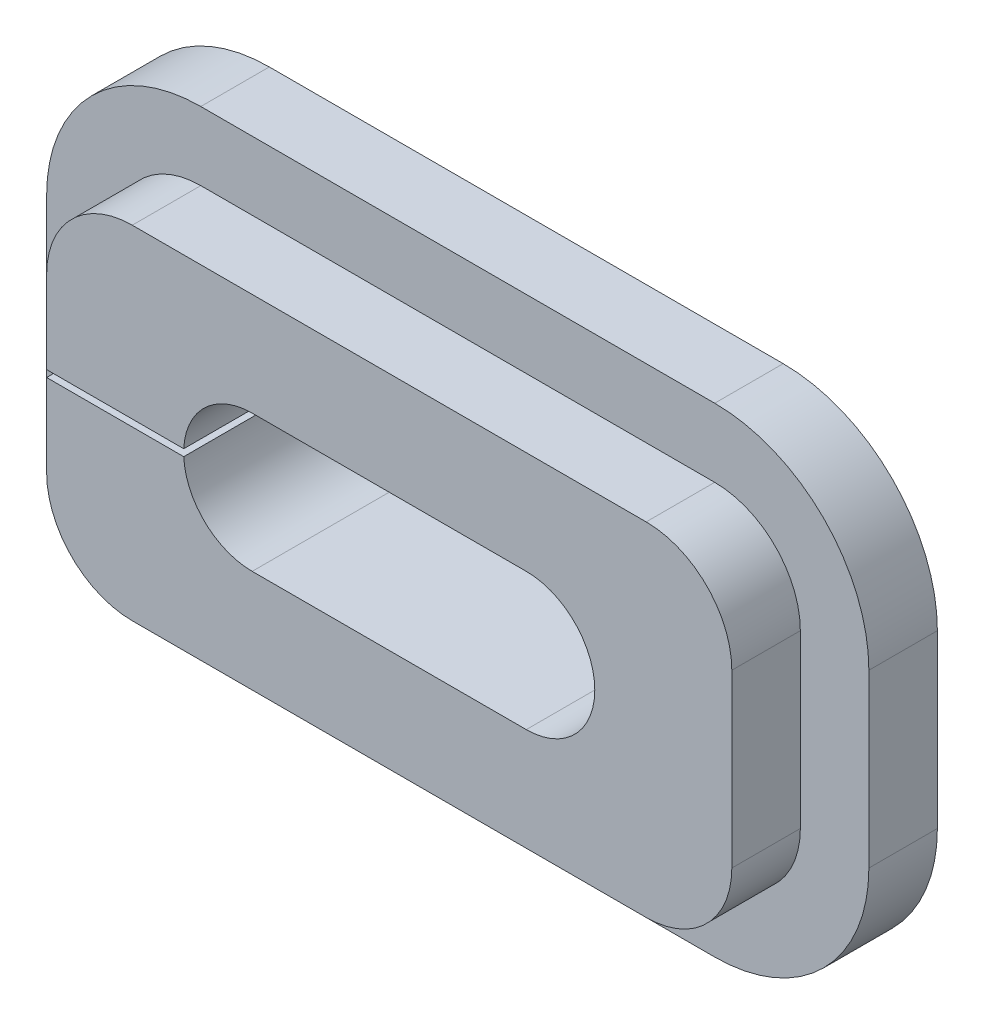
ISO-10303-21;
HEADER;
FILE_DESCRIPTION(('STEP AP214'),'2;1');
FILE_NAME('part.step','',(''),(''),'','','');
FILE_SCHEMA(('AUTOMOTIVE_DESIGN { 1 0 10303 214 1 1 1 1 }'));
ENDSEC;
DATA;
#1=APPLICATION_CONTEXT('core data for automotive mechanical design processes');
#2=APPLICATION_PROTOCOL_DEFINITION('international standard','automotive_design',2000,#1);
#3=PRODUCT_CONTEXT('',#1,'mechanical');
#4=PRODUCT('Part','Part','',(#3));
#5=PRODUCT_RELATED_PRODUCT_CATEGORY('part','',(#4));
#6=PRODUCT_DEFINITION_FORMATION('','',#4);
#7=PRODUCT_DEFINITION_CONTEXT('part definition',#1,'design');
#8=PRODUCT_DEFINITION('design','',#6,#7);
#9=PRODUCT_DEFINITION_SHAPE('','',#8);
#10=(LENGTH_UNIT() NAMED_UNIT(*) SI_UNIT(.MILLI.,.METRE.));
#11=(NAMED_UNIT(*) PLANE_ANGLE_UNIT() SI_UNIT($,.RADIAN.));
#12=(NAMED_UNIT(*) SI_UNIT($,.STERADIAN.) SOLID_ANGLE_UNIT());
#13=UNCERTAINTY_MEASURE_WITH_UNIT(LENGTH_MEASURE(1.E-05),#10,'distance_accuracy_value','');
#14=(GEOMETRIC_REPRESENTATION_CONTEXT(3) GLOBAL_UNCERTAINTY_ASSIGNED_CONTEXT((#13)) GLOBAL_UNIT_ASSIGNED_CONTEXT((#10,
#11,#12)) REPRESENTATION_CONTEXT('',''));
#15=CARTESIAN_POINT('',(0.,0.,0.));
#16=DIRECTION('',(0.,0.,1.));
#17=DIRECTION('',(1.,0.,0.));
#18=AXIS2_PLACEMENT_3D('',#15,#16,#17);
#19=CARTESIAN_POINT('',(-10.,0.,2.));
#20=DIRECTION('',(1.,0.,0.));
#21=DIRECTION('',(0.,1.,0.));
#22=AXIS2_PLACEMENT_3D('',#19,#20,#21);
#23=PLANE('',#22);
#24=DIRECTION('',(0.,-1.,0.));
#25=VECTOR('',#24,1.);
#26=CARTESIAN_POINT('',(-10.,0.,0.));
#27=LINE('',#26,#25);
#28=CARTESIAN_POINT('',(-10.,2.5,0.));
#29=VERTEX_POINT('',#28);
#30=CARTESIAN_POINT('',(-10.,0.0999999999999995,0.));
#31=VERTEX_POINT('',#30);
#32=EDGE_CURVE('E334',#29,#31,#27,.T.);
#33=ORIENTED_EDGE('',*,*,#32,.T.);
#34=DIRECTION('',(0.,0.,1.));
#35=VECTOR('',#34,1.);
#36=CARTESIAN_POINT('',(-10.,0.099999999999999,2.));
#37=LINE('',#36,#35);
#38=CARTESIAN_POINT('',(-10.,0.099999999999999,2.));
#39=VERTEX_POINT('',#38);
#40=EDGE_CURVE('E56',#31,#39,#37,.T.);
#41=ORIENTED_EDGE('',*,*,#40,.T.);
#42=DIRECTION('',(0.,-1.,0.));
#43=VECTOR('',#42,1.);
#44=CARTESIAN_POINT('',(-10.,0.,2.));
#45=LINE('',#44,#43);
#46=CARTESIAN_POINT('',(-10.,2.5,2.));
#47=VERTEX_POINT('',#46);
#48=EDGE_CURVE('E321',#47,#39,#45,.T.);
#49=ORIENTED_EDGE('',*,*,#48,.F.);
#50=DIRECTION('',(0.,0.,-1.));
#51=VECTOR('',#50,1.);
#52=CARTESIAN_POINT('',(-10.,2.5,0.));
#53=LINE('',#52,#51);
#54=EDGE_CURVE('E382',#47,#29,#53,.T.);
#55=ORIENTED_EDGE('',*,*,#54,.T.);
#56=EDGE_LOOP('',(#33,#41,#49,#55));
#57=FACE_BOUND('',#56,.T.);
#58=ADVANCED_FACE('F33',(#57),#23,.F.);
#59=CARTESIAN_POINT('',(-4.,0.,2.));
#60=DIRECTION('',(0.,0.,-1.));
#61=DIRECTION('',(-1.,0.,0.));
#62=AXIS2_PLACEMENT_3D('',#59,#60,#61);
#63=CYLINDRICAL_SURFACE('',#62,2.);
#64=DIRECTION('',(0.,0.,-1.));
#65=VECTOR('',#64,1.);
#66=CARTESIAN_POINT('',(-5.99749843554382,0.1,2.));
#67=LINE('',#66,#65);
#68=CARTESIAN_POINT('',(-5.99749843554382,0.1,-2.));
#69=VERTEX_POINT('',#68);
#70=CARTESIAN_POINT('',(-5.99749843554382,0.1,2.));
#71=VERTEX_POINT('',#70);
#72=EDGE_CURVE('E263',#69,#71,#67,.F.);
#73=ORIENTED_EDGE('',*,*,#72,.F.);
#74=CARTESIAN_POINT('',(-4.,0.,-2.));
#75=DIRECTION('',(0.,0.,-1.));
#76=DIRECTION('',(-1.,0.,0.));
#77=AXIS2_PLACEMENT_3D('',#74,#75,#76);
#78=CIRCLE('',#77,2.);
#79=CARTESIAN_POINT('',(-4.,2.,-2.));
#80=VERTEX_POINT('',#79);
#81=EDGE_CURVE('E246',#80,#69,#78,.F.);
#82=ORIENTED_EDGE('',*,*,#81,.F.);
#83=DIRECTION('',(0.,0.,-1.));
#84=VECTOR('',#83,1.);
#85=CARTESIAN_POINT('',(-4.,2.,2.));
#86=LINE('',#85,#84);
#87=CARTESIAN_POINT('',(-4.,2.,2.));
#88=VERTEX_POINT('',#87);
#89=EDGE_CURVE('E345',#88,#80,#86,.T.);
#90=ORIENTED_EDGE('',*,*,#89,.F.);
#91=CARTESIAN_POINT('',(-4.,0.,2.));
#92=DIRECTION('',(0.,0.,1.));
#93=DIRECTION('',(1.,0.,0.));
#94=AXIS2_PLACEMENT_3D('',#91,#92,#93);
#95=CIRCLE('',#94,2.);
#96=EDGE_CURVE('E301',#88,#71,#95,.T.);
#97=ORIENTED_EDGE('',*,*,#96,.T.);
#98=EDGE_LOOP('',(#73,#82,#90,#97));
#99=FACE_BOUND('',#98,.T.);
#100=ADVANCED_FACE('F466',(#99),#63,.F.);
#101=CARTESIAN_POINT('',(-12.,0.,-2.));
#102=DIRECTION('',(-1.,0.,0.));
#103=DIRECTION('',(0.,0.,1.));
#104=AXIS2_PLACEMENT_3D('',#101,#102,#103);
#105=PLANE('',#104);
#106=DIRECTION('',(0.,0.,1.));
#107=VECTOR('',#106,1.);
#108=CARTESIAN_POINT('',(-12.,0.0999999999999985,-2.));
#109=LINE('',#108,#107);
#110=CARTESIAN_POINT('',(-12.,0.0999999999999985,-2.));
#111=VERTEX_POINT('',#110);
#112=CARTESIAN_POINT('',(-12.,0.0999999999999985,0.));
#113=VERTEX_POINT('',#112);
#114=EDGE_CURVE('E220',#111,#113,#109,.T.);
#115=ORIENTED_EDGE('',*,*,#114,.T.);
#116=DIRECTION('',(0.,-1.,0.));
#117=VECTOR('',#116,1.);
#118=CARTESIAN_POINT('',(-12.,0.,0.));
#119=LINE('',#118,#117);
#120=CARTESIAN_POINT('',(-12.,2.5,0.));
#121=VERTEX_POINT('',#120);
#122=EDGE_CURVE('E266',#121,#113,#119,.T.);
#123=ORIENTED_EDGE('',*,*,#122,.F.);
#124=DIRECTION('',(0.,0.,1.));
#125=VECTOR('',#124,1.);
#126=CARTESIAN_POINT('',(-12.,2.5,-2.));
#127=LINE('',#126,#125);
#128=CARTESIAN_POINT('',(-12.,2.5,-2.));
#129=VERTEX_POINT('',#128);
#130=EDGE_CURVE('E293',#129,#121,#127,.T.);
#131=ORIENTED_EDGE('',*,*,#130,.F.);
#132=DIRECTION('',(0.,-1.,0.));
#133=VECTOR('',#132,1.);
#134=CARTESIAN_POINT('',(-12.,0.,-2.));
#135=LINE('',#134,#133);
#136=EDGE_CURVE('E227',#129,#111,#135,.T.);
#137=ORIENTED_EDGE('',*,*,#136,.T.);
#138=EDGE_LOOP('',(#115,#123,#131,#137));
#139=FACE_BOUND('',#138,.T.);
#140=ADVANCED_FACE('F436',(#139),#105,.T.);
#141=CARTESIAN_POINT('',(10.,0.,2.));
#142=DIRECTION('',(1.,0.,0.));
#143=DIRECTION('',(0.,0.,-1.));
#144=AXIS2_PLACEMENT_3D('',#141,#142,#143);
#145=PLANE('',#144);
#146=DIRECTION('',(0.,-1.,0.));
#147=VECTOR('',#146,1.);
#148=CARTESIAN_POINT('',(10.,0.,0.));
#149=LINE('',#148,#147);
#150=CARTESIAN_POINT('',(10.,2.5,0.));
#151=VERTEX_POINT('',#150);
#152=CARTESIAN_POINT('',(10.,-2.5,0.));
#153=VERTEX_POINT('',#152);
#154=EDGE_CURVE('E300',#151,#153,#149,.T.);
#155=ORIENTED_EDGE('',*,*,#154,.F.);
#156=DIRECTION('',(0.,0.,-1.));
#157=VECTOR('',#156,1.);
#158=CARTESIAN_POINT('',(10.,2.5,2.));
#159=LINE('',#158,#157);
#160=CARTESIAN_POINT('',(10.,2.5,2.));
#161=VERTEX_POINT('',#160);
#162=EDGE_CURVE('E367',#151,#161,#159,.F.);
#163=ORIENTED_EDGE('',*,*,#162,.T.);
#164=DIRECTION('',(0.,-1.,0.));
#165=VECTOR('',#164,1.);
#166=CARTESIAN_POINT('',(10.,0.,2.));
#167=LINE('',#166,#165);
#168=CARTESIAN_POINT('',(10.,-2.5,2.));
#169=VERTEX_POINT('',#168);
#170=EDGE_CURVE('E314',#161,#169,#167,.T.);
#171=ORIENTED_EDGE('',*,*,#170,.T.);
#172=DIRECTION('',(0.,0.,-1.));
#173=VECTOR('',#172,1.);
#174=CARTESIAN_POINT('',(10.,-2.5,0.));
#175=LINE('',#174,#173);
#176=EDGE_CURVE('E364',#169,#153,#175,.T.);
#177=ORIENTED_EDGE('',*,*,#176,.T.);
#178=EDGE_LOOP('',(#155,#163,#171,#177));
#179=FACE_BOUND('',#178,.T.);
#180=ADVANCED_FACE('F484',(#179),#145,.T.);
#181=CARTESIAN_POINT('',(0.,5.,2.));
#182=DIRECTION('',(0.,1.,0.));
#183=DIRECTION('',(0.,0.,1.));
#184=AXIS2_PLACEMENT_3D('',#181,#182,#183);
#185=PLANE('',#184);
#186=DIRECTION('',(1.,0.,0.));
#187=VECTOR('',#186,1.);
#188=CARTESIAN_POINT('',(0.,5.,2.));
#189=LINE('',#188,#187);
#190=CARTESIAN_POINT('',(-7.5,5.,2.));
#191=VERTEX_POINT('',#190);
#192=CARTESIAN_POINT('',(7.5,5.,2.));
#193=VERTEX_POINT('',#192);
#194=EDGE_CURVE('E317',#191,#193,#189,.T.);
#195=ORIENTED_EDGE('',*,*,#194,.T.);
#196=DIRECTION('',(0.,0.,-1.));
#197=VECTOR('',#196,1.);
#198=CARTESIAN_POINT('',(7.5,5.,2.));
#199=LINE('',#198,#197);
#200=CARTESIAN_POINT('',(7.5,5.,0.));
#201=VERTEX_POINT('',#200);
#202=EDGE_CURVE('E349',#193,#201,#199,.T.);
#203=ORIENTED_EDGE('',*,*,#202,.T.);
#204=DIRECTION('',(1.,0.,0.));
#205=VECTOR('',#204,1.);
#206=CARTESIAN_POINT('',(0.,5.,0.));
#207=LINE('',#206,#205);
#208=CARTESIAN_POINT('',(-7.5,5.,0.));
#209=VERTEX_POINT('',#208);
#210=EDGE_CURVE('E330',#209,#201,#207,.T.);
#211=ORIENTED_EDGE('',*,*,#210,.F.);
#212=DIRECTION('',(0.,0.,-1.));
#213=VECTOR('',#212,1.);
#214=CARTESIAN_POINT('',(-7.5,5.,2.));
#215=LINE('',#214,#213);
#216=EDGE_CURVE('E347',#209,#191,#215,.F.);
#217=ORIENTED_EDGE('',*,*,#216,.T.);
#218=EDGE_LOOP('',(#195,#203,#211,#217));
#219=FACE_BOUND('',#218,.T.);
#220=ADVANCED_FACE('F476',(#219),#185,.T.);
#221=CARTESIAN_POINT('',(-10.,-0.100000000000001,2.));
#222=VERTEX_POINT('',#221);
#223=CARTESIAN_POINT('',(-10.,-2.5,2.));
#224=VERTEX_POINT('',#223);
#225=EDGE_CURVE('E320',#222,#224,#45,.T.);
#226=ORIENTED_EDGE('',*,*,#225,.F.);
#227=DIRECTION('',(0.,0.,-1.));
#228=VECTOR('',#227,1.);
#229=CARTESIAN_POINT('',(-10.,-0.100000000000001,2.));
#230=LINE('',#229,#228);
#231=CARTESIAN_POINT('',(-10.,-0.100000000000001,0.));
#232=VERTEX_POINT('',#231);
#233=EDGE_CURVE('E391',#222,#232,#230,.T.);
#234=ORIENTED_EDGE('',*,*,#233,.T.);
#235=CARTESIAN_POINT('',(-10.,-2.5,0.));
#236=VERTEX_POINT('',#235);
#237=EDGE_CURVE('E333',#232,#236,#27,.T.);
#238=ORIENTED_EDGE('',*,*,#237,.T.);
#239=DIRECTION('',(0.,0.,-1.));
#240=VECTOR('',#239,1.);
#241=CARTESIAN_POINT('',(-10.,-2.5,2.));
#242=LINE('',#241,#240);
#243=EDGE_CURVE('E385',#236,#224,#242,.F.);
#244=ORIENTED_EDGE('',*,*,#243,.T.);
#245=EDGE_LOOP('',(#226,#234,#238,#244));
#246=FACE_BOUND('',#245,.T.);
#247=ADVANCED_FACE('F395',(#246),#23,.F.);
#248=DIRECTION('',(0.,0.,-1.));
#249=VECTOR('',#248,1.);
#250=CARTESIAN_POINT('',(-5.99749843554382,-0.100000000000001,2.));
#251=LINE('',#250,#249);
#252=CARTESIAN_POINT('',(-5.99749843554382,-0.100000000000001,2.));
#253=VERTEX_POINT('',#252);
#254=CARTESIAN_POINT('',(-5.99749843554382,-0.100000000000001,-2.));
#255=VERTEX_POINT('',#254);
#256=EDGE_CURVE('E206',#253,#255,#251,.T.);
#257=ORIENTED_EDGE('',*,*,#256,.F.);
#258=CARTESIAN_POINT('',(-4.,-2.,2.));
#259=VERTEX_POINT('',#258);
#260=EDGE_CURVE('E305',#253,#259,#95,.T.);
#261=ORIENTED_EDGE('',*,*,#260,.T.);
#262=DIRECTION('',(0.,0.,-1.));
#263=VECTOR('',#262,1.);
#264=CARTESIAN_POINT('',(-4.,-2.,2.));
#265=LINE('',#264,#263);
#266=CARTESIAN_POINT('',(-4.,-2.,-2.));
#267=VERTEX_POINT('',#266);
#268=EDGE_CURVE('E327',#259,#267,#265,.T.);
#269=ORIENTED_EDGE('',*,*,#268,.T.);
#270=EDGE_CURVE('E245',#255,#267,#78,.F.);
#271=ORIENTED_EDGE('',*,*,#270,.F.);
#272=EDGE_LOOP('',(#257,#261,#269,#271));
#273=FACE_BOUND('',#272,.T.);
#274=ADVANCED_FACE('F448',(#273),#63,.F.);
#275=CARTESIAN_POINT('',(0.,2.,2.));
#276=DIRECTION('',(0.,-1.,0.));
#277=DIRECTION('',(1.,0.,0.));
#278=AXIS2_PLACEMENT_3D('',#275,#276,#277);
#279=PLANE('',#278);
#280=ORIENTED_EDGE('',*,*,#89,.T.);
#281=DIRECTION('',(-1.,0.,0.));
#282=VECTOR('',#281,1.);
#283=CARTESIAN_POINT('',(0.,2.,-2.));
#284=LINE('',#283,#282);
#285=CARTESIAN_POINT('',(4.,2.,-2.));
#286=VERTEX_POINT('',#285);
#287=EDGE_CURVE('E255',#286,#80,#284,.T.);
#288=ORIENTED_EDGE('',*,*,#287,.F.);
#289=DIRECTION('',(0.,0.,-1.));
#290=VECTOR('',#289,1.);
#291=CARTESIAN_POINT('',(4.,2.,2.));
#292=LINE('',#291,#290);
#293=CARTESIAN_POINT('',(4.,2.,2.));
#294=VERTEX_POINT('',#293);
#295=EDGE_CURVE('E343',#294,#286,#292,.T.);
#296=ORIENTED_EDGE('',*,*,#295,.F.);
#297=DIRECTION('',(-1.,0.,0.));
#298=VECTOR('',#297,1.);
#299=CARTESIAN_POINT('',(0.,2.,2.));
#300=LINE('',#299,#298);
#301=EDGE_CURVE('E304',#294,#88,#300,.T.);
#302=ORIENTED_EDGE('',*,*,#301,.T.);
#303=EDGE_LOOP('',(#280,#288,#296,#302));
#304=FACE_BOUND('',#303,.T.);
#305=ADVANCED_FACE('F463',(#304),#279,.T.);
#306=CARTESIAN_POINT('',(4.,0.,2.));
#307=DIRECTION('',(0.,0.,-1.));
#308=DIRECTION('',(-1.,0.,0.));
#309=AXIS2_PLACEMENT_3D('',#306,#307,#308);
#310=CYLINDRICAL_SURFACE('',#309,2.);
#311=ORIENTED_EDGE('',*,*,#295,.T.);
#312=CARTESIAN_POINT('',(4.,0.,-2.));
#313=DIRECTION('',(0.,0.,-1.));
#314=DIRECTION('',(-1.,0.,0.));
#315=AXIS2_PLACEMENT_3D('',#312,#313,#314);
#316=CIRCLE('',#315,2.);
#317=CARTESIAN_POINT('',(4.,-2.,-2.));
#318=VERTEX_POINT('',#317);
#319=EDGE_CURVE('E252',#318,#286,#316,.F.);
#320=ORIENTED_EDGE('',*,*,#319,.F.);
#321=DIRECTION('',(0.,0.,-1.));
#322=VECTOR('',#321,1.);
#323=CARTESIAN_POINT('',(4.,-2.,2.));
#324=LINE('',#323,#322);
#325=CARTESIAN_POINT('',(4.,-2.,2.));
#326=VERTEX_POINT('',#325);
#327=EDGE_CURVE('E341',#326,#318,#324,.T.);
#328=ORIENTED_EDGE('',*,*,#327,.F.);
#329=CARTESIAN_POINT('',(4.,0.,2.));
#330=DIRECTION('',(0.,0.,1.));
#331=DIRECTION('',(1.,0.,0.));
#332=AXIS2_PLACEMENT_3D('',#329,#330,#331);
#333=CIRCLE('',#332,2.);
#334=EDGE_CURVE('E308',#326,#294,#333,.T.);
#335=ORIENTED_EDGE('',*,*,#334,.T.);
#336=EDGE_LOOP('',(#311,#320,#328,#335));
#337=FACE_BOUND('',#336,.T.);
#338=ADVANCED_FACE('F461',(#337),#310,.F.);
#339=CARTESIAN_POINT('',(0.,-2.,2.));
#340=DIRECTION('',(0.,-1.,0.));
#341=DIRECTION('',(1.,0.,0.));
#342=AXIS2_PLACEMENT_3D('',#339,#340,#341);
#343=PLANE('',#342);
#344=ORIENTED_EDGE('',*,*,#327,.T.);
#345=DIRECTION('',(1.,0.,0.));
#346=VECTOR('',#345,1.);
#347=CARTESIAN_POINT('',(0.,-2.,-2.));
#348=LINE('',#347,#346);
#349=EDGE_CURVE('E249',#267,#318,#348,.T.);
#350=ORIENTED_EDGE('',*,*,#349,.F.);
#351=ORIENTED_EDGE('',*,*,#268,.F.);
#352=DIRECTION('',(-1.,0.,0.));
#353=VECTOR('',#352,1.);
#354=CARTESIAN_POINT('',(0.,-2.,2.));
#355=LINE('',#354,#353);
#356=EDGE_CURVE('E311',#326,#259,#355,.T.);
#357=ORIENTED_EDGE('',*,*,#356,.F.);
#358=EDGE_LOOP('',(#344,#350,#351,#357));
#359=FACE_BOUND('',#358,.T.);
#360=ADVANCED_FACE('F457',(#359),#343,.F.);
#361=CARTESIAN_POINT('',(0.,-5.,2.));
#362=DIRECTION('',(0.,1.,0.));
#363=DIRECTION('',(0.,0.,1.));
#364=AXIS2_PLACEMENT_3D('',#361,#362,#363);
#365=PLANE('',#364);
#366=DIRECTION('',(1.,0.,0.));
#367=VECTOR('',#366,1.);
#368=CARTESIAN_POINT('',(0.,-5.,0.));
#369=LINE('',#368,#367);
#370=CARTESIAN_POINT('',(-7.5,-5.,0.));
#371=VERTEX_POINT('',#370);
#372=CARTESIAN_POINT('',(7.5,-5.,0.));
#373=VERTEX_POINT('',#372);
#374=EDGE_CURVE('E337',#371,#373,#369,.T.);
#375=ORIENTED_EDGE('',*,*,#374,.T.);
#376=DIRECTION('',(0.,0.,-1.));
#377=VECTOR('',#376,1.);
#378=CARTESIAN_POINT('',(7.5,-5.,2.));
#379=LINE('',#378,#377);
#380=CARTESIAN_POINT('',(7.5,-5.,2.));
#381=VERTEX_POINT('',#380);
#382=EDGE_CURVE('E380',#373,#381,#379,.F.);
#383=ORIENTED_EDGE('',*,*,#382,.T.);
#384=DIRECTION('',(1.,0.,0.));
#385=VECTOR('',#384,1.);
#386=CARTESIAN_POINT('',(0.,-5.,2.));
#387=LINE('',#386,#385);
#388=CARTESIAN_POINT('',(-7.5,-5.,2.));
#389=VERTEX_POINT('',#388);
#390=EDGE_CURVE('E324',#389,#381,#387,.T.);
#391=ORIENTED_EDGE('',*,*,#390,.F.);
#392=DIRECTION('',(0.,0.,-1.));
#393=VECTOR('',#392,1.);
#394=CARTESIAN_POINT('',(-7.5,-5.,2.));
#395=LINE('',#394,#393);
#396=EDGE_CURVE('E377',#389,#371,#395,.T.);
#397=ORIENTED_EDGE('',*,*,#396,.T.);
#398=EDGE_LOOP('',(#375,#383,#391,#397));
#399=FACE_BOUND('',#398,.T.);
#400=ADVANCED_FACE('F493',(#399),#365,.F.);
#401=CARTESIAN_POINT('',(0.,0.,2.));
#402=DIRECTION('',(0.,0.,1.));
#403=DIRECTION('',(1.,0.,0.));
#404=AXIS2_PLACEMENT_3D('',#401,#402,#403);
#405=PLANE('',#404);
#406=DIRECTION('',(-1.,0.,0.));
#407=VECTOR('',#406,1.);
#408=CARTESIAN_POINT('',(-12.,0.0999999999999985,2.));
#409=LINE('',#408,#407);
#410=EDGE_CURVE('E211',#71,#39,#409,.T.);
#411=ORIENTED_EDGE('',*,*,#410,.F.);
#412=ORIENTED_EDGE('',*,*,#96,.F.);
#413=ORIENTED_EDGE('',*,*,#301,.F.);
#414=ORIENTED_EDGE('',*,*,#334,.F.);
#415=ORIENTED_EDGE('',*,*,#356,.T.);
#416=ORIENTED_EDGE('',*,*,#260,.F.);
#417=DIRECTION('',(1.,0.,0.));
#418=VECTOR('',#417,1.);
#419=CARTESIAN_POINT('',(-12.,-0.100000000000001,2.));
#420=LINE('',#419,#418);
#421=EDGE_CURVE('E444',#222,#253,#420,.T.);
#422=ORIENTED_EDGE('',*,*,#421,.F.);
#423=ORIENTED_EDGE('',*,*,#225,.T.);
#424=CARTESIAN_POINT('',(-7.5,-2.5,2.));
#425=DIRECTION('',(0.,0.,1.));
#426=DIRECTION('',(1.,0.,0.));
#427=AXIS2_PLACEMENT_3D('',#424,#425,#426);
#428=CIRCLE('',#427,2.5);
#429=EDGE_CURVE('E371',#224,#389,#428,.T.);
#430=ORIENTED_EDGE('',*,*,#429,.T.);
#431=ORIENTED_EDGE('',*,*,#390,.T.);
#432=CARTESIAN_POINT('',(7.5,-2.5,2.));
#433=DIRECTION('',(0.,0.,1.));
#434=DIRECTION('',(1.,0.,0.));
#435=AXIS2_PLACEMENT_3D('',#432,#433,#434);
#436=CIRCLE('',#435,2.5);
#437=EDGE_CURVE('E373',#381,#169,#436,.T.);
#438=ORIENTED_EDGE('',*,*,#437,.T.);
#439=ORIENTED_EDGE('',*,*,#170,.F.);
#440=CARTESIAN_POINT('',(7.5,2.5,2.));
#441=DIRECTION('',(0.,0.,1.));
#442=DIRECTION('',(1.,0.,0.));
#443=AXIS2_PLACEMENT_3D('',#440,#441,#442);
#444=CIRCLE('',#443,2.5);
#445=EDGE_CURVE('E375',#161,#193,#444,.T.);
#446=ORIENTED_EDGE('',*,*,#445,.T.);
#447=ORIENTED_EDGE('',*,*,#194,.F.);
#448=CARTESIAN_POINT('',(-7.5,2.5,2.));
#449=DIRECTION('',(0.,0.,1.));
#450=DIRECTION('',(1.,0.,0.));
#451=AXIS2_PLACEMENT_3D('',#448,#449,#450);
#452=CIRCLE('',#451,2.5);
#453=EDGE_CURVE('E369',#191,#47,#452,.T.);
#454=ORIENTED_EDGE('',*,*,#453,.T.);
#455=ORIENTED_EDGE('',*,*,#48,.T.);
#456=EDGE_LOOP('',(#411,#412,#413,#414,#415,#416,#422,#423,#430,#431,#438,#439,#446,#447,#454,#455));
#457=FACE_BOUND('',#456,.T.);
#458=ADVANCED_FACE('F450',(#457),#405,.T.);
#459=CARTESIAN_POINT('',(7.5,2.5,2.));
#460=DIRECTION('',(0.,0.,-1.));
#461=DIRECTION('',(-1.,0.,0.));
#462=AXIS2_PLACEMENT_3D('',#459,#460,#461);
#463=CYLINDRICAL_SURFACE('',#462,2.5);
#464=ORIENTED_EDGE('',*,*,#445,.F.);
#465=ORIENTED_EDGE('',*,*,#162,.F.);
#466=CARTESIAN_POINT('',(7.5,2.5,0.));
#467=DIRECTION('',(0.,0.,1.));
#468=DIRECTION('',(1.,0.,0.));
#469=AXIS2_PLACEMENT_3D('',#466,#467,#468);
#470=CIRCLE('',#469,2.5);
#471=EDGE_CURVE('E361',#201,#151,#470,.F.);
#472=ORIENTED_EDGE('',*,*,#471,.F.);
#473=ORIENTED_EDGE('',*,*,#202,.F.);
#474=EDGE_LOOP('',(#464,#465,#472,#473));
#475=FACE_BOUND('',#474,.T.);
#476=ADVANCED_FACE('F480',(#475),#463,.T.);
#477=CARTESIAN_POINT('',(7.5,-2.5,2.));
#478=DIRECTION('',(0.,0.,1.));
#479=DIRECTION('',(1.,0.,0.));
#480=AXIS2_PLACEMENT_3D('',#477,#478,#479);
#481=CYLINDRICAL_SURFACE('',#480,2.5);
#482=ORIENTED_EDGE('',*,*,#437,.F.);
#483=ORIENTED_EDGE('',*,*,#382,.F.);
#484=CARTESIAN_POINT('',(7.5,-2.5,0.));
#485=DIRECTION('',(0.,0.,1.));
#486=DIRECTION('',(1.,0.,0.));
#487=AXIS2_PLACEMENT_3D('',#484,#485,#486);
#488=CIRCLE('',#487,2.5);
#489=EDGE_CURVE('E358',#153,#373,#488,.F.);
#490=ORIENTED_EDGE('',*,*,#489,.F.);
#491=ORIENTED_EDGE('',*,*,#176,.F.);
#492=EDGE_LOOP('',(#482,#483,#490,#491));
#493=FACE_BOUND('',#492,.T.);
#494=ADVANCED_FACE('F490',(#493),#481,.T.);
#495=CARTESIAN_POINT('',(-7.5,-2.5,2.));
#496=DIRECTION('',(0.,0.,-1.));
#497=DIRECTION('',(-1.,0.,0.));
#498=AXIS2_PLACEMENT_3D('',#495,#496,#497);
#499=CYLINDRICAL_SURFACE('',#498,2.5);
#500=ORIENTED_EDGE('',*,*,#429,.F.);
#501=ORIENTED_EDGE('',*,*,#243,.F.);
#502=CARTESIAN_POINT('',(-7.5,-2.5,0.));
#503=DIRECTION('',(0.,0.,1.));
#504=DIRECTION('',(1.,0.,0.));
#505=AXIS2_PLACEMENT_3D('',#502,#503,#504);
#506=CIRCLE('',#505,2.5);
#507=EDGE_CURVE('E355',#371,#236,#506,.F.);
#508=ORIENTED_EDGE('',*,*,#507,.F.);
#509=ORIENTED_EDGE('',*,*,#396,.F.);
#510=EDGE_LOOP('',(#500,#501,#508,#509));
#511=FACE_BOUND('',#510,.T.);
#512=ADVANCED_FACE('F497',(#511),#499,.T.);
#513=CARTESIAN_POINT('',(-7.5,2.5,2.));
#514=DIRECTION('',(0.,0.,1.));
#515=DIRECTION('',(1.,0.,0.));
#516=AXIS2_PLACEMENT_3D('',#513,#514,#515);
#517=CYLINDRICAL_SURFACE('',#516,2.5);
#518=ORIENTED_EDGE('',*,*,#453,.F.);
#519=ORIENTED_EDGE('',*,*,#216,.F.);
#520=CARTESIAN_POINT('',(-7.5,2.5,0.));
#521=DIRECTION('',(0.,0.,1.));
#522=DIRECTION('',(1.,0.,0.));
#523=AXIS2_PLACEMENT_3D('',#520,#521,#522);
#524=CIRCLE('',#523,2.5);
#525=EDGE_CURVE('E352',#29,#209,#524,.F.);
#526=ORIENTED_EDGE('',*,*,#525,.F.);
#527=ORIENTED_EDGE('',*,*,#54,.F.);
#528=EDGE_LOOP('',(#518,#519,#526,#527));
#529=FACE_BOUND('',#528,.T.);
#530=ADVANCED_FACE('F35',(#529),#517,.T.);
#531=CARTESIAN_POINT('',(0.,-7.,-2.));
#532=DIRECTION('',(0.,1.,0.));
#533=DIRECTION('',(0.,0.,1.));
#534=AXIS2_PLACEMENT_3D('',#531,#532,#533);
#535=PLANE('',#534);
#536=DIRECTION('',(-1.,0.,0.));
#537=VECTOR('',#536,1.);
#538=CARTESIAN_POINT('',(0.,-7.,0.));
#539=LINE('',#538,#537);
#540=CARTESIAN_POINT('',(7.5,-7.,0.));
#541=VERTEX_POINT('',#540);
#542=CARTESIAN_POINT('',(-7.5,-7.,0.));
#543=VERTEX_POINT('',#542);
#544=EDGE_CURVE('E259',#541,#543,#539,.T.);
#545=ORIENTED_EDGE('',*,*,#544,.T.);
#546=DIRECTION('',(0.,0.,1.));
#547=VECTOR('',#546,1.);
#548=CARTESIAN_POINT('',(-7.5,-7.,-2.));
#549=LINE('',#548,#547);
#550=CARTESIAN_POINT('',(-7.5,-7.,-2.));
#551=VERTEX_POINT('',#550);
#552=EDGE_CURVE('E297',#551,#543,#549,.T.);
#553=ORIENTED_EDGE('',*,*,#552,.F.);
#554=DIRECTION('',(-1.,0.,0.));
#555=VECTOR('',#554,1.);
#556=CARTESIAN_POINT('',(0.,-7.,-2.));
#557=LINE('',#556,#555);
#558=CARTESIAN_POINT('',(7.5,-7.,-2.));
#559=VERTEX_POINT('',#558);
#560=EDGE_CURVE('E231',#559,#551,#557,.T.);
#561=ORIENTED_EDGE('',*,*,#560,.F.);
#562=DIRECTION('',(0.,0.,1.));
#563=VECTOR('',#562,1.);
#564=CARTESIAN_POINT('',(7.5,-7.,-2.));
#565=LINE('',#564,#563);
#566=EDGE_CURVE('E258',#559,#541,#565,.T.);
#567=ORIENTED_EDGE('',*,*,#566,.T.);
#568=EDGE_LOOP('',(#545,#553,#561,#567));
#569=FACE_BOUND('',#568,.T.);
#570=ADVANCED_FACE('F408',(#569),#535,.F.);
#571=CARTESIAN_POINT('',(-7.5,-2.5,-2.));
#572=DIRECTION('',(0.,0.,1.));
#573=DIRECTION('',(1.,0.,0.));
#574=AXIS2_PLACEMENT_3D('',#571,#572,#573);
#575=CYLINDRICAL_SURFACE('',#574,4.5);
#576=CARTESIAN_POINT('',(-7.5,-2.5,0.));
#577=DIRECTION('',(0.,0.,-1.));
#578=DIRECTION('',(-1.,0.,0.));
#579=AXIS2_PLACEMENT_3D('',#576,#577,#578);
#580=CIRCLE('',#579,4.5);
#581=CARTESIAN_POINT('',(-12.,-2.5,0.));
#582=VERTEX_POINT('',#581);
#583=EDGE_CURVE('E262',#543,#582,#580,.T.);
#584=ORIENTED_EDGE('',*,*,#583,.T.);
#585=DIRECTION('',(0.,0.,1.));
#586=VECTOR('',#585,1.);
#587=CARTESIAN_POINT('',(-12.,-2.5,-2.));
#588=LINE('',#587,#586);
#589=CARTESIAN_POINT('',(-12.,-2.5,-2.));
#590=VERTEX_POINT('',#589);
#591=EDGE_CURVE('E295',#590,#582,#588,.T.);
#592=ORIENTED_EDGE('',*,*,#591,.F.);
#593=CARTESIAN_POINT('',(-7.5,-2.5,-2.));
#594=DIRECTION('',(0.,0.,-1.));
#595=DIRECTION('',(-1.,0.,0.));
#596=AXIS2_PLACEMENT_3D('',#593,#594,#595);
#597=CIRCLE('',#596,4.5);
#598=EDGE_CURVE('E225',#551,#590,#597,.T.);
#599=ORIENTED_EDGE('',*,*,#598,.F.);
#600=ORIENTED_EDGE('',*,*,#552,.T.);
#601=EDGE_LOOP('',(#584,#592,#599,#600));
#602=FACE_BOUND('',#601,.T.);
#603=ADVANCED_FACE('F411',(#602),#575,.T.);
#604=DIRECTION('',(0.,0.,1.));
#605=VECTOR('',#604,1.);
#606=CARTESIAN_POINT('',(-12.,-0.100000000000001,-2.));
#607=LINE('',#606,#605);
#608=CARTESIAN_POINT('',(-12.,-0.100000000000001,-2.));
#609=VERTEX_POINT('',#608);
#610=CARTESIAN_POINT('',(-12.,-0.100000000000001,0.));
#611=VERTEX_POINT('',#610);
#612=EDGE_CURVE('E48',#609,#611,#607,.T.);
#613=ORIENTED_EDGE('',*,*,#612,.F.);
#614=EDGE_CURVE('E217',#609,#590,#135,.T.);
#615=ORIENTED_EDGE('',*,*,#614,.T.);
#616=ORIENTED_EDGE('',*,*,#591,.T.);
#617=EDGE_CURVE('E219',#611,#582,#119,.T.);
#618=ORIENTED_EDGE('',*,*,#617,.F.);
#619=EDGE_LOOP('',(#613,#615,#616,#618));
#620=FACE_BOUND('',#619,.T.);
#621=ADVANCED_FACE('F215',(#620),#105,.T.);
#622=CARTESIAN_POINT('',(-7.5,2.5,-2.));
#623=DIRECTION('',(0.,0.,1.));
#624=DIRECTION('',(1.,0.,0.));
#625=AXIS2_PLACEMENT_3D('',#622,#623,#624);
#626=CYLINDRICAL_SURFACE('',#625,4.5);
#627=CARTESIAN_POINT('',(-7.5,2.5,0.));
#628=DIRECTION('',(0.,0.,-1.));
#629=DIRECTION('',(-1.,0.,0.));
#630=AXIS2_PLACEMENT_3D('',#627,#628,#629);
#631=CIRCLE('',#630,4.5);
#632=CARTESIAN_POINT('',(-7.5,7.,0.));
#633=VERTEX_POINT('',#632);
#634=EDGE_CURVE('E269',#121,#633,#631,.T.);
#635=ORIENTED_EDGE('',*,*,#634,.T.);
#636=DIRECTION('',(0.,0.,1.));
#637=VECTOR('',#636,1.);
#638=CARTESIAN_POINT('',(-7.5,7.,-2.));
#639=LINE('',#638,#637);
#640=CARTESIAN_POINT('',(-7.5,7.,-2.));
#641=VERTEX_POINT('',#640);
#642=EDGE_CURVE('E291',#641,#633,#639,.T.);
#643=ORIENTED_EDGE('',*,*,#642,.F.);
#644=CARTESIAN_POINT('',(-7.5,2.5,-2.));
#645=DIRECTION('',(0.,0.,-1.));
#646=DIRECTION('',(-1.,0.,0.));
#647=AXIS2_PLACEMENT_3D('',#644,#645,#646);
#648=CIRCLE('',#647,4.5);
#649=EDGE_CURVE('E230',#129,#641,#648,.T.);
#650=ORIENTED_EDGE('',*,*,#649,.F.);
#651=ORIENTED_EDGE('',*,*,#130,.T.);
#652=EDGE_LOOP('',(#635,#643,#650,#651));
#653=FACE_BOUND('',#652,.T.);
#654=ADVANCED_FACE('F433',(#653),#626,.T.);
#655=CARTESIAN_POINT('',(0.,7.,-2.));
#656=DIRECTION('',(0.,1.,0.));
#657=DIRECTION('',(0.,0.,1.));
#658=AXIS2_PLACEMENT_3D('',#655,#656,#657);
#659=PLANE('',#658);
#660=DIRECTION('',(-1.,0.,0.));
#661=VECTOR('',#660,1.);
#662=CARTESIAN_POINT('',(0.,7.,0.));
#663=LINE('',#662,#661);
#664=CARTESIAN_POINT('',(7.5,7.,0.));
#665=VERTEX_POINT('',#664);
#666=EDGE_CURVE('E272',#665,#633,#663,.T.);
#667=ORIENTED_EDGE('',*,*,#666,.F.);
#668=DIRECTION('',(0.,0.,1.));
#669=VECTOR('',#668,1.);
#670=CARTESIAN_POINT('',(7.5,7.,-2.));
#671=LINE('',#670,#669);
#672=CARTESIAN_POINT('',(7.5,7.,-2.));
#673=VERTEX_POINT('',#672);
#674=EDGE_CURVE('E289',#673,#665,#671,.T.);
#675=ORIENTED_EDGE('',*,*,#674,.F.);
#676=DIRECTION('',(-1.,0.,0.));
#677=VECTOR('',#676,1.);
#678=CARTESIAN_POINT('',(0.,7.,-2.));
#679=LINE('',#678,#677);
#680=EDGE_CURVE('E236',#673,#641,#679,.T.);
#681=ORIENTED_EDGE('',*,*,#680,.T.);
#682=ORIENTED_EDGE('',*,*,#642,.T.);
#683=EDGE_LOOP('',(#667,#675,#681,#682));
#684=FACE_BOUND('',#683,.T.);
#685=ADVANCED_FACE('F429',(#684),#659,.T.);
#686=CARTESIAN_POINT('',(7.5,2.5,-2.));
#687=DIRECTION('',(0.,0.,1.));
#688=DIRECTION('',(1.,0.,0.));
#689=AXIS2_PLACEMENT_3D('',#686,#687,#688);
#690=CYLINDRICAL_SURFACE('',#689,4.5);
#691=CARTESIAN_POINT('',(7.5,2.5,0.));
#692=DIRECTION('',(0.,0.,-1.));
#693=DIRECTION('',(-1.,0.,0.));
#694=AXIS2_PLACEMENT_3D('',#691,#692,#693);
#695=CIRCLE('',#694,4.5);
#696=CARTESIAN_POINT('',(12.,2.5,0.));
#697=VERTEX_POINT('',#696);
#698=EDGE_CURVE('E275',#665,#697,#695,.T.);
#699=ORIENTED_EDGE('',*,*,#698,.T.);
#700=DIRECTION('',(0.,0.,1.));
#701=VECTOR('',#700,1.);
#702=CARTESIAN_POINT('',(12.,2.5,-2.));
#703=LINE('',#702,#701);
#704=CARTESIAN_POINT('',(12.,2.5,-2.));
#705=VERTEX_POINT('',#704);
#706=EDGE_CURVE('E286',#705,#697,#703,.T.);
#707=ORIENTED_EDGE('',*,*,#706,.F.);
#708=CARTESIAN_POINT('',(7.5,2.5,-2.));
#709=DIRECTION('',(0.,0.,-1.));
#710=DIRECTION('',(-1.,0.,0.));
#711=AXIS2_PLACEMENT_3D('',#708,#709,#710);
#712=CIRCLE('',#711,4.5);
#713=EDGE_CURVE('E239',#673,#705,#712,.T.);
#714=ORIENTED_EDGE('',*,*,#713,.F.);
#715=ORIENTED_EDGE('',*,*,#674,.T.);
#716=EDGE_LOOP('',(#699,#707,#714,#715));
#717=FACE_BOUND('',#716,.T.);
#718=ADVANCED_FACE('F424',(#717),#690,.T.);
#719=CARTESIAN_POINT('',(12.,0.,-2.));
#720=DIRECTION('',(-1.,0.,0.));
#721=DIRECTION('',(0.,0.,1.));
#722=AXIS2_PLACEMENT_3D('',#719,#720,#721);
#723=PLANE('',#722);
#724=DIRECTION('',(0.,-1.,0.));
#725=VECTOR('',#724,1.);
#726=CARTESIAN_POINT('',(12.,0.,0.));
#727=LINE('',#726,#725);
#728=CARTESIAN_POINT('',(12.,-2.5,0.));
#729=VERTEX_POINT('',#728);
#730=EDGE_CURVE('E277',#697,#729,#727,.T.);
#731=ORIENTED_EDGE('',*,*,#730,.T.);
#732=DIRECTION('',(0.,0.,1.));
#733=VECTOR('',#732,1.);
#734=CARTESIAN_POINT('',(12.,-2.5,-2.));
#735=LINE('',#734,#733);
#736=CARTESIAN_POINT('',(12.,-2.5,-2.));
#737=VERTEX_POINT('',#736);
#738=EDGE_CURVE('E283',#737,#729,#735,.T.);
#739=ORIENTED_EDGE('',*,*,#738,.F.);
#740=DIRECTION('',(0.,-1.,0.));
#741=VECTOR('',#740,1.);
#742=CARTESIAN_POINT('',(12.,0.,-2.));
#743=LINE('',#742,#741);
#744=EDGE_CURVE('E241',#705,#737,#743,.T.);
#745=ORIENTED_EDGE('',*,*,#744,.F.);
#746=ORIENTED_EDGE('',*,*,#706,.T.);
#747=EDGE_LOOP('',(#731,#739,#745,#746));
#748=FACE_BOUND('',#747,.T.);
#749=ADVANCED_FACE('F420',(#748),#723,.F.);
#750=CARTESIAN_POINT('',(7.5,-2.5,-2.));
#751=DIRECTION('',(0.,0.,1.));
#752=DIRECTION('',(1.,0.,0.));
#753=AXIS2_PLACEMENT_3D('',#750,#751,#752);
#754=CYLINDRICAL_SURFACE('',#753,4.5);
#755=CARTESIAN_POINT('',(7.5,-2.5,0.));
#756=DIRECTION('',(0.,0.,-1.));
#757=DIRECTION('',(-1.,0.,0.));
#758=AXIS2_PLACEMENT_3D('',#755,#756,#757);
#759=CIRCLE('',#758,4.5);
#760=EDGE_CURVE('E279',#729,#541,#759,.T.);
#761=ORIENTED_EDGE('',*,*,#760,.T.);
#762=ORIENTED_EDGE('',*,*,#566,.F.);
#763=CARTESIAN_POINT('',(7.5,-2.5,-2.));
#764=DIRECTION('',(0.,0.,-1.));
#765=DIRECTION('',(-1.,0.,0.));
#766=AXIS2_PLACEMENT_3D('',#763,#764,#765);
#767=CIRCLE('',#766,4.5);
#768=EDGE_CURVE('E243',#737,#559,#767,.T.);
#769=ORIENTED_EDGE('',*,*,#768,.F.);
#770=ORIENTED_EDGE('',*,*,#738,.T.);
#771=EDGE_LOOP('',(#761,#762,#769,#770));
#772=FACE_BOUND('',#771,.T.);
#773=ADVANCED_FACE('F416',(#772),#754,.T.);
#774=CARTESIAN_POINT('',(0.,0.,-2.));
#775=DIRECTION('',(0.,0.,-1.));
#776=DIRECTION('',(-1.,0.,0.));
#777=AXIS2_PLACEMENT_3D('',#774,#775,#776);
#778=PLANE('',#777);
#779=DIRECTION('',(-1.,0.,0.));
#780=VECTOR('',#779,1.);
#781=CARTESIAN_POINT('',(-12.,0.0999999999999985,-2.));
#782=LINE('',#781,#780);
#783=EDGE_CURVE('E210',#69,#111,#782,.T.);
#784=ORIENTED_EDGE('',*,*,#783,.T.);
#785=ORIENTED_EDGE('',*,*,#136,.F.);
#786=ORIENTED_EDGE('',*,*,#649,.T.);
#787=ORIENTED_EDGE('',*,*,#680,.F.);
#788=ORIENTED_EDGE('',*,*,#713,.T.);
#789=ORIENTED_EDGE('',*,*,#744,.T.);
#790=ORIENTED_EDGE('',*,*,#768,.T.);
#791=ORIENTED_EDGE('',*,*,#560,.T.);
#792=ORIENTED_EDGE('',*,*,#598,.T.);
#793=ORIENTED_EDGE('',*,*,#614,.F.);
#794=DIRECTION('',(1.,0.,0.));
#795=VECTOR('',#794,1.);
#796=CARTESIAN_POINT('',(-12.,-0.100000000000001,-2.));
#797=LINE('',#796,#795);
#798=EDGE_CURVE('E203',#609,#255,#797,.T.);
#799=ORIENTED_EDGE('',*,*,#798,.T.);
#800=ORIENTED_EDGE('',*,*,#270,.T.);
#801=ORIENTED_EDGE('',*,*,#349,.T.);
#802=ORIENTED_EDGE('',*,*,#319,.T.);
#803=ORIENTED_EDGE('',*,*,#287,.T.);
#804=ORIENTED_EDGE('',*,*,#81,.T.);
#805=EDGE_LOOP('',(#784,#785,#786,#787,#788,#789,#790,#791,#792,#793,#799,#800,#801,#802,#803,#804));
#806=FACE_BOUND('',#805,.T.);
#807=ADVANCED_FACE('F223',(#806),#778,.T.);
#808=CARTESIAN_POINT('',(0.,0.,0.));
#809=DIRECTION('',(0.,0.,-1.));
#810=DIRECTION('',(-1.,0.,0.));
#811=AXIS2_PLACEMENT_3D('',#808,#809,#810);
#812=PLANE('',#811);
#813=ORIENTED_EDGE('',*,*,#122,.T.);
#814=DIRECTION('',(1.,0.,0.));
#815=VECTOR('',#814,1.);
#816=CARTESIAN_POINT('',(0.,0.100000000000001,0.));
#817=LINE('',#816,#815);
#818=EDGE_CURVE('E11',#113,#31,#817,.T.);
#819=ORIENTED_EDGE('',*,*,#818,.T.);
#820=ORIENTED_EDGE('',*,*,#32,.F.);
#821=ORIENTED_EDGE('',*,*,#525,.T.);
#822=ORIENTED_EDGE('',*,*,#210,.T.);
#823=ORIENTED_EDGE('',*,*,#471,.T.);
#824=ORIENTED_EDGE('',*,*,#154,.T.);
#825=ORIENTED_EDGE('',*,*,#489,.T.);
#826=ORIENTED_EDGE('',*,*,#374,.F.);
#827=ORIENTED_EDGE('',*,*,#507,.T.);
#828=ORIENTED_EDGE('',*,*,#237,.F.);
#829=DIRECTION('',(-1.,0.,0.));
#830=VECTOR('',#829,1.);
#831=CARTESIAN_POINT('',(0.,-0.100000000000001,0.));
#832=LINE('',#831,#830);
#833=EDGE_CURVE('E41',#232,#611,#832,.T.);
#834=ORIENTED_EDGE('',*,*,#833,.T.);
#835=ORIENTED_EDGE('',*,*,#617,.T.);
#836=ORIENTED_EDGE('',*,*,#583,.F.);
#837=ORIENTED_EDGE('',*,*,#544,.F.);
#838=ORIENTED_EDGE('',*,*,#760,.F.);
#839=ORIENTED_EDGE('',*,*,#730,.F.);
#840=ORIENTED_EDGE('',*,*,#698,.F.);
#841=ORIENTED_EDGE('',*,*,#666,.T.);
#842=ORIENTED_EDGE('',*,*,#634,.F.);
#843=EDGE_LOOP('',(#813,#819,#820,#821,#822,#823,#824,#825,#826,#827,#828,#834,#835,#836,#837,
#838,#839,#840,#841,#842));
#844=FACE_BOUND('',#843,.T.);
#845=ADVANCED_FACE('F389',(#844),#812,.F.);
#846=CARTESIAN_POINT('',(-12.,-0.100000000000001,-2.));
#847=DIRECTION('',(0.,-1.,0.));
#848=DIRECTION('',(0.,0.,-1.));
#849=AXIS2_PLACEMENT_3D('',#846,#847,#848);
#850=PLANE('',#849);
#851=ORIENTED_EDGE('',*,*,#256,.T.);
#852=ORIENTED_EDGE('',*,*,#798,.F.);
#853=ORIENTED_EDGE('',*,*,#612,.T.);
#854=ORIENTED_EDGE('',*,*,#833,.F.);
#855=ORIENTED_EDGE('',*,*,#233,.F.);
#856=ORIENTED_EDGE('',*,*,#421,.T.);
#857=EDGE_LOOP('',(#851,#852,#853,#854,#855,#856));
#858=FACE_BOUND('',#857,.T.);
#859=ADVANCED_FACE('F204',(#858),#850,.F.);
#860=CARTESIAN_POINT('',(-12.,0.0999999999999985,-2.));
#861=DIRECTION('',(0.,1.,0.));
#862=DIRECTION('',(-1.,0.,0.));
#863=AXIS2_PLACEMENT_3D('',#860,#861,#862);
#864=PLANE('',#863);
#865=ORIENTED_EDGE('',*,*,#72,.T.);
#866=ORIENTED_EDGE('',*,*,#410,.T.);
#867=ORIENTED_EDGE('',*,*,#40,.F.);
#868=ORIENTED_EDGE('',*,*,#818,.F.);
#869=ORIENTED_EDGE('',*,*,#114,.F.);
#870=ORIENTED_EDGE('',*,*,#783,.F.);
#871=EDGE_LOOP('',(#865,#866,#867,#868,#869,#870));
#872=FACE_BOUND('',#871,.T.);
#873=ADVANCED_FACE('F438',(#872),#864,.F.);
#874=CLOSED_SHELL('',(#58,#100,#140,#180,#220,#247,#274,#305,#338,#360,#400,#458,#476,#494,#512,
#530,#570,#603,#621,#654,#685,#718,#749,#773,#807,#845,#859,#873));
#875=MANIFOLD_SOLID_BREP('B2',#874);
#876=ADVANCED_BREP_SHAPE_REPRESENTATION('',(#18,#875),#14);
#877=SHAPE_DEFINITION_REPRESENTATION(#9,#876);
ENDSEC;
END-ISO-10303-21;
